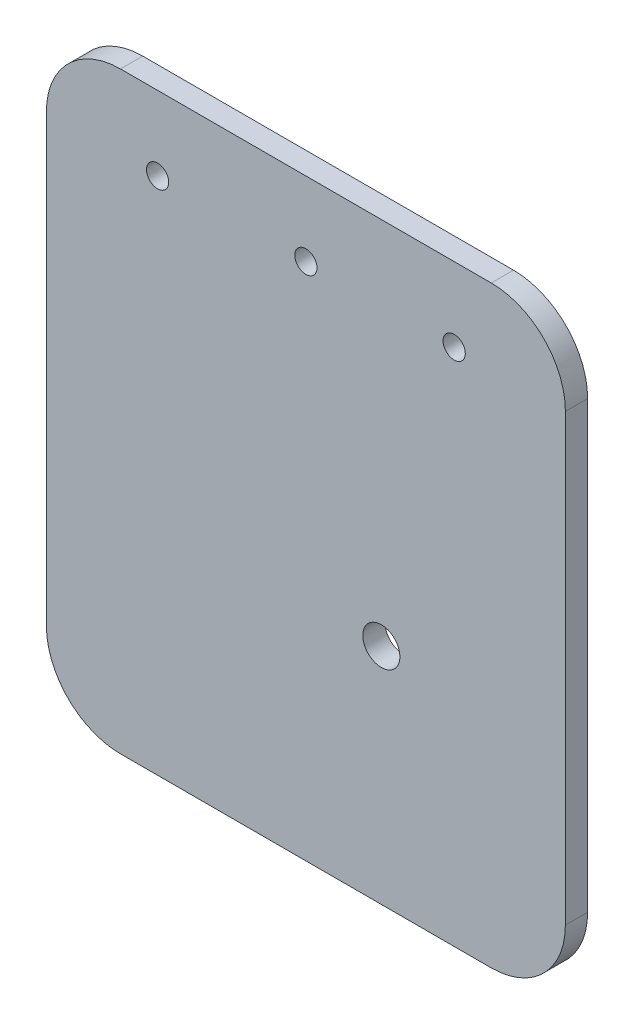
ISO-10303-21;
HEADER;
FILE_DESCRIPTION(('STEP AP214'),'2;1');
FILE_NAME('part.step','',(''),(''),'','','');
FILE_SCHEMA(('AUTOMOTIVE_DESIGN { 1 0 10303 214 1 1 1 1 }'));
ENDSEC;
DATA;
#1=APPLICATION_CONTEXT('core data for automotive mechanical design processes');
#2=APPLICATION_PROTOCOL_DEFINITION('international standard','automotive_design',2000,#1);
#3=PRODUCT_CONTEXT('',#1,'mechanical');
#4=PRODUCT('Part','Part','',(#3));
#5=PRODUCT_RELATED_PRODUCT_CATEGORY('part','',(#4));
#6=PRODUCT_DEFINITION_FORMATION('','',#4);
#7=PRODUCT_DEFINITION_CONTEXT('part definition',#1,'design');
#8=PRODUCT_DEFINITION('design','',#6,#7);
#9=PRODUCT_DEFINITION_SHAPE('','',#8);
#10=(LENGTH_UNIT() NAMED_UNIT(*) SI_UNIT(.MILLI.,.METRE.));
#11=(NAMED_UNIT(*) PLANE_ANGLE_UNIT() SI_UNIT($,.RADIAN.));
#12=(NAMED_UNIT(*) SI_UNIT($,.STERADIAN.) SOLID_ANGLE_UNIT());
#13=UNCERTAINTY_MEASURE_WITH_UNIT(LENGTH_MEASURE(1.E-05),#10,'distance_accuracy_value','');
#14=(GEOMETRIC_REPRESENTATION_CONTEXT(3) GLOBAL_UNCERTAINTY_ASSIGNED_CONTEXT((#13)) GLOBAL_UNIT_ASSIGNED_CONTEXT((#10,
#11,#12)) REPRESENTATION_CONTEXT('',''));
#15=CARTESIAN_POINT('',(0.,0.,0.));
#16=DIRECTION('',(0.,0.,1.));
#17=DIRECTION('',(1.,0.,0.));
#18=AXIS2_PLACEMENT_3D('',#15,#16,#17);
#19=CARTESIAN_POINT('',(35.,40.,3.));
#20=DIRECTION('',(-1.,0.,0.));
#21=DIRECTION('',(0.,-1.,0.));
#22=AXIS2_PLACEMENT_3D('',#19,#20,#21);
#23=PLANE('',#22);
#24=DIRECTION('',(0.,1.,0.));
#25=VECTOR('',#24,1.);
#26=CARTESIAN_POINT('',(35.,40.,3.));
#27=LINE('',#26,#25);
#28=CARTESIAN_POINT('',(35.,-30.,3.));
#29=VERTEX_POINT('',#28);
#30=CARTESIAN_POINT('',(35.,30.,3.));
#31=VERTEX_POINT('',#30);
#32=EDGE_CURVE('E125',#29,#31,#27,.T.);
#33=ORIENTED_EDGE('',*,*,#32,.F.);
#34=DIRECTION('',(0.,0.,-1.));
#35=VECTOR('',#34,1.);
#36=CARTESIAN_POINT('',(35.,-30.,3.));
#37=LINE('',#36,#35);
#38=CARTESIAN_POINT('',(35.,-30.,0.));
#39=VERTEX_POINT('',#38);
#40=EDGE_CURVE('E109',#29,#39,#37,.T.);
#41=ORIENTED_EDGE('',*,*,#40,.T.);
#42=DIRECTION('',(0.,1.,0.));
#43=VECTOR('',#42,1.);
#44=CARTESIAN_POINT('',(35.,40.,0.));
#45=LINE('',#44,#43);
#46=CARTESIAN_POINT('',(35.,30.,0.));
#47=VERTEX_POINT('',#46);
#48=EDGE_CURVE('E122',#39,#47,#45,.T.);
#49=ORIENTED_EDGE('',*,*,#48,.T.);
#50=DIRECTION('',(0.,0.,-1.));
#51=VECTOR('',#50,1.);
#52=CARTESIAN_POINT('',(35.,30.,3.));
#53=LINE('',#52,#51);
#54=EDGE_CURVE('E128',#47,#31,#53,.F.);
#55=ORIENTED_EDGE('',*,*,#54,.T.);
#56=EDGE_LOOP('',(#33,#41,#49,#55));
#57=FACE_BOUND('',#56,.T.);
#58=ADVANCED_FACE('F38',(#57),#23,.F.);
#59=CARTESIAN_POINT('',(-35.,40.,3.));
#60=DIRECTION('',(0.,-1.,0.));
#61=DIRECTION('',(0.,0.,-1.));
#62=AXIS2_PLACEMENT_3D('',#59,#60,#61);
#63=PLANE('',#62);
#64=DIRECTION('',(-1.,0.,0.));
#65=VECTOR('',#64,1.);
#66=CARTESIAN_POINT('',(-35.,40.,0.));
#67=LINE('',#66,#65);
#68=CARTESIAN_POINT('',(25.,40.,0.));
#69=VERTEX_POINT('',#68);
#70=CARTESIAN_POINT('',(-25.,40.,0.));
#71=VERTEX_POINT('',#70);
#72=EDGE_CURVE('E133',#69,#71,#67,.T.);
#73=ORIENTED_EDGE('',*,*,#72,.T.);
#74=DIRECTION('',(0.,0.,-1.));
#75=VECTOR('',#74,1.);
#76=CARTESIAN_POINT('',(-25.,40.,3.));
#77=LINE('',#76,#75);
#78=CARTESIAN_POINT('',(-25.,40.,3.));
#79=VERTEX_POINT('',#78);
#80=EDGE_CURVE('E11',#71,#79,#77,.F.);
#81=ORIENTED_EDGE('',*,*,#80,.T.);
#82=DIRECTION('',(-1.,0.,0.));
#83=VECTOR('',#82,1.);
#84=CARTESIAN_POINT('',(-35.,40.,3.));
#85=LINE('',#84,#83);
#86=CARTESIAN_POINT('',(25.,40.,3.));
#87=VERTEX_POINT('',#86);
#88=EDGE_CURVE('E204',#87,#79,#85,.T.);
#89=ORIENTED_EDGE('',*,*,#88,.F.);
#90=DIRECTION('',(0.,0.,-1.));
#91=VECTOR('',#90,1.);
#92=CARTESIAN_POINT('',(25.,40.,3.));
#93=LINE('',#92,#91);
#94=EDGE_CURVE('E47',#87,#69,#93,.T.);
#95=ORIENTED_EDGE('',*,*,#94,.T.);
#96=EDGE_LOOP('',(#73,#81,#89,#95));
#97=FACE_BOUND('',#96,.T.);
#98=ADVANCED_FACE('F202',(#97),#63,.F.);
#99=CARTESIAN_POINT('',(-35.,40.,3.));
#100=DIRECTION('',(1.,0.,0.));
#101=DIRECTION('',(0.,1.,0.));
#102=AXIS2_PLACEMENT_3D('',#99,#100,#101);
#103=PLANE('',#102);
#104=DIRECTION('',(0.,-1.,0.));
#105=VECTOR('',#104,1.);
#106=CARTESIAN_POINT('',(-35.,40.,0.));
#107=LINE('',#106,#105);
#108=CARTESIAN_POINT('',(-35.,30.,0.));
#109=VERTEX_POINT('',#108);
#110=CARTESIAN_POINT('',(-35.,-30.,0.));
#111=VERTEX_POINT('',#110);
#112=EDGE_CURVE('E139',#109,#111,#107,.T.);
#113=ORIENTED_EDGE('',*,*,#112,.T.);
#114=DIRECTION('',(0.,0.,-1.));
#115=VECTOR('',#114,1.);
#116=CARTESIAN_POINT('',(-35.,-30.,3.));
#117=LINE('',#116,#115);
#118=CARTESIAN_POINT('',(-35.,-30.,3.));
#119=VERTEX_POINT('',#118);
#120=EDGE_CURVE('E54',#111,#119,#117,.F.);
#121=ORIENTED_EDGE('',*,*,#120,.T.);
#122=DIRECTION('',(0.,-1.,0.));
#123=VECTOR('',#122,1.);
#124=CARTESIAN_POINT('',(-35.,40.,3.));
#125=LINE('',#124,#123);
#126=CARTESIAN_POINT('',(-35.,30.,3.));
#127=VERTEX_POINT('',#126);
#128=EDGE_CURVE('E212',#127,#119,#125,.T.);
#129=ORIENTED_EDGE('',*,*,#128,.F.);
#130=DIRECTION('',(0.,0.,-1.));
#131=VECTOR('',#130,1.);
#132=CARTESIAN_POINT('',(-35.,30.,3.));
#133=LINE('',#132,#131);
#134=EDGE_CURVE('E192',#127,#109,#133,.T.);
#135=ORIENTED_EDGE('',*,*,#134,.T.);
#136=EDGE_LOOP('',(#113,#121,#129,#135));
#137=FACE_BOUND('',#136,.T.);
#138=ADVANCED_FACE('F211',(#137),#103,.F.);
#139=CARTESIAN_POINT('',(-35.,-40.,3.));
#140=DIRECTION('',(0.,1.,0.));
#141=DIRECTION('',(0.,0.,1.));
#142=AXIS2_PLACEMENT_3D('',#139,#140,#141);
#143=PLANE('',#142);
#144=DIRECTION('',(1.,0.,0.));
#145=VECTOR('',#144,1.);
#146=CARTESIAN_POINT('',(-35.,-40.,0.));
#147=LINE('',#146,#145);
#148=CARTESIAN_POINT('',(-25.,-40.,0.));
#149=VERTEX_POINT('',#148);
#150=CARTESIAN_POINT('',(25.,-40.,0.));
#151=VERTEX_POINT('',#150);
#152=EDGE_CURVE('E150',#149,#151,#147,.T.);
#153=ORIENTED_EDGE('',*,*,#152,.T.);
#154=DIRECTION('',(0.,0.,-1.));
#155=VECTOR('',#154,1.);
#156=CARTESIAN_POINT('',(25.,-40.,3.));
#157=LINE('',#156,#155);
#158=CARTESIAN_POINT('',(25.,-40.,3.));
#159=VERTEX_POINT('',#158);
#160=EDGE_CURVE('E110',#151,#159,#157,.F.);
#161=ORIENTED_EDGE('',*,*,#160,.T.);
#162=DIRECTION('',(1.,0.,0.));
#163=VECTOR('',#162,1.);
#164=CARTESIAN_POINT('',(-35.,-40.,3.));
#165=LINE('',#164,#163);
#166=CARTESIAN_POINT('',(-25.,-40.,3.));
#167=VERTEX_POINT('',#166);
#168=EDGE_CURVE('E145',#167,#159,#165,.T.);
#169=ORIENTED_EDGE('',*,*,#168,.F.);
#170=DIRECTION('',(0.,0.,-1.));
#171=VECTOR('',#170,1.);
#172=CARTESIAN_POINT('',(-25.,-40.,3.));
#173=LINE('',#172,#171);
#174=EDGE_CURVE('E116',#167,#149,#173,.T.);
#175=ORIENTED_EDGE('',*,*,#174,.T.);
#176=EDGE_LOOP('',(#153,#161,#169,#175));
#177=FACE_BOUND('',#176,.T.);
#178=ADVANCED_FACE('F242',(#177),#143,.F.);
#179=CARTESIAN_POINT('',(0.,0.,3.));
#180=DIRECTION('',(0.,0.,1.));
#181=DIRECTION('',(1.,0.,0.));
#182=AXIS2_PLACEMENT_3D('',#179,#180,#181);
#183=PLANE('',#182);
#184=CARTESIAN_POINT('',(20.,30.,3.));
#185=DIRECTION('',(0.,0.,1.));
#186=DIRECTION('',(1.,0.,0.));
#187=AXIS2_PLACEMENT_3D('',#184,#185,#186);
#188=CIRCLE('',#187,1.5);
#189=CARTESIAN_POINT('',(21.5,30.,3.));
#190=VERTEX_POINT('',#189);
#191=EDGE_CURVE('E163',#190,#190,#188,.T.);
#192=ORIENTED_EDGE('',*,*,#191,.F.);
#193=EDGE_LOOP('',(#192));
#194=FACE_BOUND('',#193,.T.);
#195=CARTESIAN_POINT('',(-20.,30.,3.));
#196=DIRECTION('',(0.,0.,1.));
#197=DIRECTION('',(1.,0.,0.));
#198=AXIS2_PLACEMENT_3D('',#195,#196,#197);
#199=CIRCLE('',#198,1.5);
#200=CARTESIAN_POINT('',(-18.5,30.,3.));
#201=VERTEX_POINT('',#200);
#202=EDGE_CURVE('E228',#201,#201,#199,.T.);
#203=ORIENTED_EDGE('',*,*,#202,.F.);
#204=EDGE_LOOP('',(#203));
#205=FACE_BOUND('',#204,.T.);
#206=CARTESIAN_POINT('',(0.,30.,3.));
#207=DIRECTION('',(0.,0.,1.));
#208=DIRECTION('',(1.,0.,0.));
#209=AXIS2_PLACEMENT_3D('',#206,#207,#208);
#210=CIRCLE('',#209,1.5);
#211=CARTESIAN_POINT('',(1.5,30.,3.));
#212=VERTEX_POINT('',#211);
#213=EDGE_CURVE('E157',#212,#212,#210,.T.);
#214=ORIENTED_EDGE('',*,*,#213,.F.);
#215=EDGE_LOOP('',(#214));
#216=FACE_BOUND('',#215,.T.);
#217=CARTESIAN_POINT('',(10.175,-9.8249999999997,3.));
#218=DIRECTION('',(0.,0.,1.));
#219=DIRECTION('',(1.,0.,0.));
#220=AXIS2_PLACEMENT_3D('',#217,#218,#219);
#221=CIRCLE('',#220,2.5);
#222=CARTESIAN_POINT('',(12.675,-9.8249999999997,3.));
#223=VERTEX_POINT('',#222);
#224=EDGE_CURVE('E134',#223,#223,#221,.T.);
#225=ORIENTED_EDGE('',*,*,#224,.F.);
#226=EDGE_LOOP('',(#225));
#227=FACE_BOUND('',#226,.T.);
#228=ORIENTED_EDGE('',*,*,#168,.T.);
#229=CARTESIAN_POINT('',(25.,-30.,3.));
#230=DIRECTION('',(0.,0.,1.));
#231=DIRECTION('',(1.,0.,0.));
#232=AXIS2_PLACEMENT_3D('',#229,#230,#231);
#233=CIRCLE('',#232,10.);
#234=EDGE_CURVE('E189',#159,#29,#233,.T.);
#235=ORIENTED_EDGE('',*,*,#234,.T.);
#236=ORIENTED_EDGE('',*,*,#32,.T.);
#237=CARTESIAN_POINT('',(25.,30.,3.));
#238=DIRECTION('',(0.,0.,1.));
#239=DIRECTION('',(1.,0.,0.));
#240=AXIS2_PLACEMENT_3D('',#237,#238,#239);
#241=CIRCLE('',#240,10.);
#242=EDGE_CURVE('E181',#31,#87,#241,.T.);
#243=ORIENTED_EDGE('',*,*,#242,.T.);
#244=ORIENTED_EDGE('',*,*,#88,.T.);
#245=CARTESIAN_POINT('',(-25.,30.,3.));
#246=DIRECTION('',(0.,0.,1.));
#247=DIRECTION('',(1.,0.,0.));
#248=AXIS2_PLACEMENT_3D('',#245,#246,#247);
#249=CIRCLE('',#248,10.);
#250=EDGE_CURVE('E61',#79,#127,#249,.T.);
#251=ORIENTED_EDGE('',*,*,#250,.T.);
#252=ORIENTED_EDGE('',*,*,#128,.T.);
#253=CARTESIAN_POINT('',(-25.,-30.,3.));
#254=DIRECTION('',(0.,0.,1.));
#255=DIRECTION('',(1.,0.,0.));
#256=AXIS2_PLACEMENT_3D('',#253,#254,#255);
#257=CIRCLE('',#256,10.);
#258=EDGE_CURVE('E186',#119,#167,#257,.T.);
#259=ORIENTED_EDGE('',*,*,#258,.T.);
#260=EDGE_LOOP('',(#228,#235,#236,#243,#244,#251,#252,#259));
#261=FACE_BOUND('',#260,.T.);
#262=ADVANCED_FACE('F239',(#194,#205,#216,#227,#261),#183,.T.);
#263=CARTESIAN_POINT('',(0.,0.,0.));
#264=DIRECTION('',(0.,0.,1.));
#265=DIRECTION('',(1.,0.,0.));
#266=AXIS2_PLACEMENT_3D('',#263,#264,#265);
#267=PLANE('',#266);
#268=CARTESIAN_POINT('',(20.,30.,0.));
#269=DIRECTION('',(0.,0.,1.));
#270=DIRECTION('',(1.,0.,0.));
#271=AXIS2_PLACEMENT_3D('',#268,#269,#270);
#272=CIRCLE('',#271,1.5);
#273=CARTESIAN_POINT('',(21.5,30.,0.));
#274=VERTEX_POINT('',#273);
#275=EDGE_CURVE('E162',#274,#274,#272,.T.);
#276=ORIENTED_EDGE('',*,*,#275,.T.);
#277=EDGE_LOOP('',(#276));
#278=FACE_BOUND('',#277,.T.);
#279=CARTESIAN_POINT('',(-20.,30.,0.));
#280=DIRECTION('',(0.,0.,1.));
#281=DIRECTION('',(1.,0.,0.));
#282=AXIS2_PLACEMENT_3D('',#279,#280,#281);
#283=CIRCLE('',#282,1.5);
#284=CARTESIAN_POINT('',(-18.5,30.,0.));
#285=VERTEX_POINT('',#284);
#286=EDGE_CURVE('E158',#285,#285,#283,.T.);
#287=ORIENTED_EDGE('',*,*,#286,.T.);
#288=EDGE_LOOP('',(#287));
#289=FACE_BOUND('',#288,.T.);
#290=CARTESIAN_POINT('',(0.,30.,0.));
#291=DIRECTION('',(0.,0.,1.));
#292=DIRECTION('',(1.,0.,0.));
#293=AXIS2_PLACEMENT_3D('',#290,#291,#292);
#294=CIRCLE('',#293,1.5);
#295=CARTESIAN_POINT('',(1.5,30.,0.));
#296=VERTEX_POINT('',#295);
#297=EDGE_CURVE('E153',#296,#296,#294,.T.);
#298=ORIENTED_EDGE('',*,*,#297,.T.);
#299=EDGE_LOOP('',(#298));
#300=FACE_BOUND('',#299,.T.);
#301=CARTESIAN_POINT('',(10.175,-9.8249999999997,0.));
#302=DIRECTION('',(0.,0.,-1.));
#303=DIRECTION('',(-1.,0.,0.));
#304=AXIS2_PLACEMENT_3D('',#301,#302,#303);
#305=CIRCLE('',#304,2.5);
#306=CARTESIAN_POINT('',(7.67500000000005,-9.8249999999997,0.));
#307=VERTEX_POINT('',#306);
#308=EDGE_CURVE('E142',#307,#307,#305,.T.);
#309=ORIENTED_EDGE('',*,*,#308,.F.);
#310=EDGE_LOOP('',(#309));
#311=FACE_BOUND('',#310,.T.);
#312=ORIENTED_EDGE('',*,*,#48,.F.);
#313=CARTESIAN_POINT('',(25.,-30.,0.));
#314=DIRECTION('',(0.,0.,1.));
#315=DIRECTION('',(1.,0.,0.));
#316=AXIS2_PLACEMENT_3D('',#313,#314,#315);
#317=CIRCLE('',#316,10.);
#318=EDGE_CURVE('E105',#39,#151,#317,.F.);
#319=ORIENTED_EDGE('',*,*,#318,.T.);
#320=ORIENTED_EDGE('',*,*,#152,.F.);
#321=CARTESIAN_POINT('',(-25.,-30.,0.));
#322=DIRECTION('',(0.,0.,1.));
#323=DIRECTION('',(1.,0.,0.));
#324=AXIS2_PLACEMENT_3D('',#321,#322,#323);
#325=CIRCLE('',#324,10.);
#326=EDGE_CURVE('E117',#149,#111,#325,.F.);
#327=ORIENTED_EDGE('',*,*,#326,.T.);
#328=ORIENTED_EDGE('',*,*,#112,.F.);
#329=CARTESIAN_POINT('',(-25.,30.,0.));
#330=DIRECTION('',(0.,0.,1.));
#331=DIRECTION('',(1.,0.,0.));
#332=AXIS2_PLACEMENT_3D('',#329,#330,#331);
#333=CIRCLE('',#332,10.);
#334=EDGE_CURVE('E171',#109,#71,#333,.F.);
#335=ORIENTED_EDGE('',*,*,#334,.T.);
#336=ORIENTED_EDGE('',*,*,#72,.F.);
#337=CARTESIAN_POINT('',(25.,30.,0.));
#338=DIRECTION('',(0.,0.,1.));
#339=DIRECTION('',(1.,0.,0.));
#340=AXIS2_PLACEMENT_3D('',#337,#338,#339);
#341=CIRCLE('',#340,10.);
#342=EDGE_CURVE('E127',#69,#47,#341,.F.);
#343=ORIENTED_EDGE('',*,*,#342,.T.);
#344=EDGE_LOOP('',(#312,#319,#320,#327,#328,#335,#336,#343));
#345=FACE_BOUND('',#344,.T.);
#346=ADVANCED_FACE('F130',(#278,#289,#300,#311,#345),#267,.F.);
#347=CARTESIAN_POINT('',(10.175,-9.8249999999997,10.));
#348=DIRECTION('',(0.,0.,-1.));
#349=DIRECTION('',(-1.,0.,0.));
#350=AXIS2_PLACEMENT_3D('',#347,#348,#349);
#351=CYLINDRICAL_SURFACE('',#350,2.5);
#352=ORIENTED_EDGE('',*,*,#224,.T.);
#353=EDGE_LOOP('',(#352));
#354=FACE_BOUND('',#353,.T.);
#355=ORIENTED_EDGE('',*,*,#308,.T.);
#356=EDGE_LOOP('',(#355));
#357=FACE_BOUND('',#356,.T.);
#358=ADVANCED_FACE('F274',(#354,#357),#351,.F.);
#359=CARTESIAN_POINT('',(0.,30.,-7.));
#360=DIRECTION('',(0.,0.,1.));
#361=DIRECTION('',(1.,0.,0.));
#362=AXIS2_PLACEMENT_3D('',#359,#360,#361);
#363=CYLINDRICAL_SURFACE('',#362,1.5);
#364=ORIENTED_EDGE('',*,*,#213,.T.);
#365=EDGE_LOOP('',(#364));
#366=FACE_BOUND('',#365,.T.);
#367=ORIENTED_EDGE('',*,*,#297,.F.);
#368=EDGE_LOOP('',(#367));
#369=FACE_BOUND('',#368,.T.);
#370=ADVANCED_FACE('F279',(#366,#369),#363,.F.);
#371=CARTESIAN_POINT('',(-20.,30.,-7.));
#372=DIRECTION('',(0.,0.,1.));
#373=DIRECTION('',(1.,0.,0.));
#374=AXIS2_PLACEMENT_3D('',#371,#372,#373);
#375=CYLINDRICAL_SURFACE('',#374,1.5);
#376=ORIENTED_EDGE('',*,*,#202,.T.);
#377=EDGE_LOOP('',(#376));
#378=FACE_BOUND('',#377,.T.);
#379=ORIENTED_EDGE('',*,*,#286,.F.);
#380=EDGE_LOOP('',(#379));
#381=FACE_BOUND('',#380,.T.);
#382=ADVANCED_FACE('F283',(#378,#381),#375,.F.);
#383=CARTESIAN_POINT('',(20.,30.,-7.));
#384=DIRECTION('',(0.,0.,1.));
#385=DIRECTION('',(1.,0.,0.));
#386=AXIS2_PLACEMENT_3D('',#383,#384,#385);
#387=CYLINDRICAL_SURFACE('',#386,1.5);
#388=ORIENTED_EDGE('',*,*,#191,.T.);
#389=EDGE_LOOP('',(#388));
#390=FACE_BOUND('',#389,.T.);
#391=ORIENTED_EDGE('',*,*,#275,.F.);
#392=EDGE_LOOP('',(#391));
#393=FACE_BOUND('',#392,.T.);
#394=ADVANCED_FACE('F236',(#390,#393),#387,.F.);
#395=CARTESIAN_POINT('',(25.,-30.,3.));
#396=DIRECTION('',(0.,0.,-1.));
#397=DIRECTION('',(-1.,0.,0.));
#398=AXIS2_PLACEMENT_3D('',#395,#396,#397);
#399=CYLINDRICAL_SURFACE('',#398,10.);
#400=ORIENTED_EDGE('',*,*,#234,.F.);
#401=ORIENTED_EDGE('',*,*,#160,.F.);
#402=ORIENTED_EDGE('',*,*,#318,.F.);
#403=ORIENTED_EDGE('',*,*,#40,.F.);
#404=EDGE_LOOP('',(#400,#401,#402,#403));
#405=FACE_BOUND('',#404,.T.);
#406=ADVANCED_FACE('F108',(#405),#399,.T.);
#407=CARTESIAN_POINT('',(-25.,-30.,3.));
#408=DIRECTION('',(0.,0.,-1.));
#409=DIRECTION('',(-1.,0.,0.));
#410=AXIS2_PLACEMENT_3D('',#407,#408,#409);
#411=CYLINDRICAL_SURFACE('',#410,10.);
#412=ORIENTED_EDGE('',*,*,#258,.F.);
#413=ORIENTED_EDGE('',*,*,#120,.F.);
#414=ORIENTED_EDGE('',*,*,#326,.F.);
#415=ORIENTED_EDGE('',*,*,#174,.F.);
#416=EDGE_LOOP('',(#412,#413,#414,#415));
#417=FACE_BOUND('',#416,.T.);
#418=ADVANCED_FACE('F253',(#417),#411,.T.);
#419=CARTESIAN_POINT('',(-25.,30.,3.));
#420=DIRECTION('',(0.,0.,-1.));
#421=DIRECTION('',(-1.,0.,0.));
#422=AXIS2_PLACEMENT_3D('',#419,#420,#421);
#423=CYLINDRICAL_SURFACE('',#422,10.);
#424=ORIENTED_EDGE('',*,*,#250,.F.);
#425=ORIENTED_EDGE('',*,*,#80,.F.);
#426=ORIENTED_EDGE('',*,*,#334,.F.);
#427=ORIENTED_EDGE('',*,*,#134,.F.);
#428=EDGE_LOOP('',(#424,#425,#426,#427));
#429=FACE_BOUND('',#428,.T.);
#430=ADVANCED_FACE('F210',(#429),#423,.T.);
#431=CARTESIAN_POINT('',(25.,30.,3.));
#432=DIRECTION('',(0.,0.,-1.));
#433=DIRECTION('',(-1.,0.,0.));
#434=AXIS2_PLACEMENT_3D('',#431,#432,#433);
#435=CYLINDRICAL_SURFACE('',#434,10.);
#436=ORIENTED_EDGE('',*,*,#242,.F.);
#437=ORIENTED_EDGE('',*,*,#54,.F.);
#438=ORIENTED_EDGE('',*,*,#342,.F.);
#439=ORIENTED_EDGE('',*,*,#94,.F.);
#440=EDGE_LOOP('',(#436,#437,#438,#439));
#441=FACE_BOUND('',#440,.T.);
#442=ADVANCED_FACE('F40',(#441),#435,.T.);
#443=CLOSED_SHELL('',(#58,#98,#138,#178,#262,#346,#358,#370,#382,#394,#406,#418,#430,#442));
#444=MANIFOLD_SOLID_BREP('B2',#443);
#445=ADVANCED_BREP_SHAPE_REPRESENTATION('',(#18,#444),#14);
#446=SHAPE_DEFINITION_REPRESENTATION(#9,#445);
ENDSEC;
END-ISO-10303-21;
